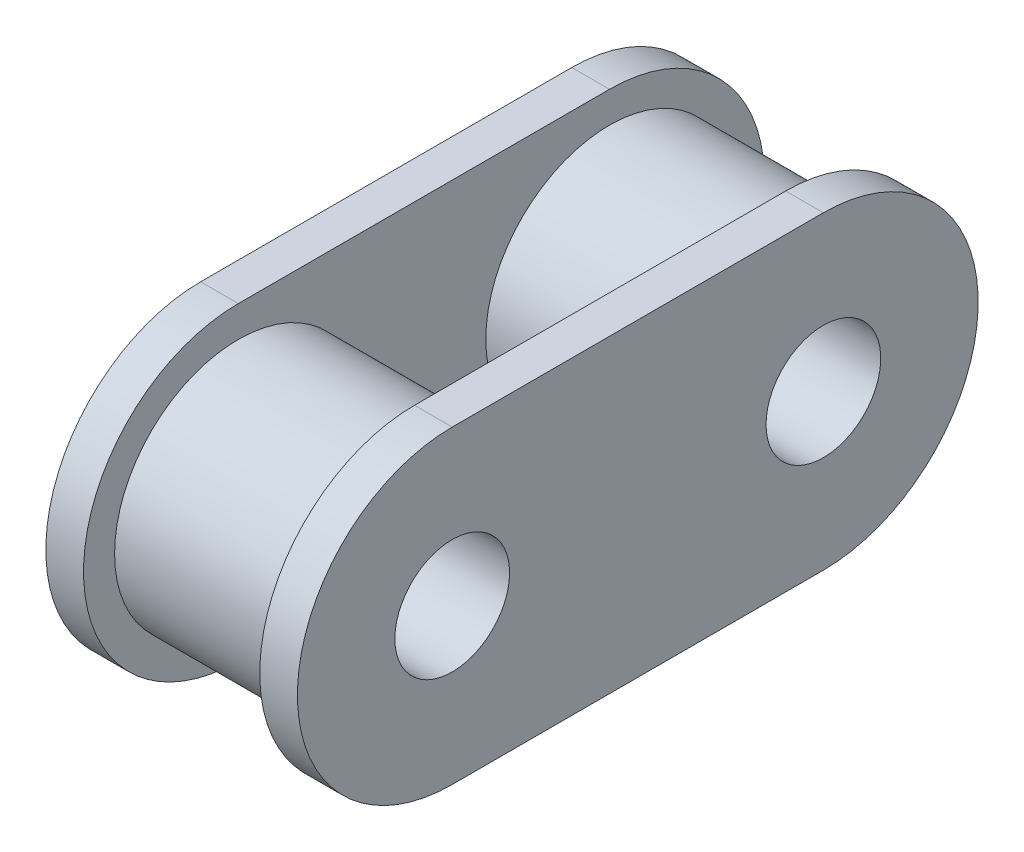
ISO-10303-21;
HEADER;
FILE_DESCRIPTION(('STEP AP214'),'2;1');
FILE_NAME('part.step','',(''),(''),'','','');
FILE_SCHEMA(('AUTOMOTIVE_DESIGN { 1 0 10303 214 1 1 1 1 }'));
ENDSEC;
DATA;
#1=APPLICATION_CONTEXT('core data for automotive mechanical design processes');
#2=APPLICATION_PROTOCOL_DEFINITION('international standard','automotive_design',2000,#1);
#3=PRODUCT_CONTEXT('',#1,'mechanical');
#4=PRODUCT('Part','Part','',(#3));
#5=PRODUCT_RELATED_PRODUCT_CATEGORY('part','',(#4));
#6=PRODUCT_DEFINITION_FORMATION('','',#4);
#7=PRODUCT_DEFINITION_CONTEXT('part definition',#1,'design');
#8=PRODUCT_DEFINITION('design','',#6,#7);
#9=PRODUCT_DEFINITION_SHAPE('','',#8);
#10=(LENGTH_UNIT() NAMED_UNIT(*) SI_UNIT(.MILLI.,.METRE.));
#11=(NAMED_UNIT(*) PLANE_ANGLE_UNIT() SI_UNIT($,.RADIAN.));
#12=(NAMED_UNIT(*) SI_UNIT($,.STERADIAN.) SOLID_ANGLE_UNIT());
#13=UNCERTAINTY_MEASURE_WITH_UNIT(LENGTH_MEASURE(1.E-05),#10,'distance_accuracy_value','');
#14=(GEOMETRIC_REPRESENTATION_CONTEXT(3) GLOBAL_UNCERTAINTY_ASSIGNED_CONTEXT((#13)) GLOBAL_UNIT_ASSIGNED_CONTEXT((#10,
#11,#12)) REPRESENTATION_CONTEXT('',''));
#15=CARTESIAN_POINT('',(0.,0.,0.));
#16=DIRECTION('',(0.,0.,1.));
#17=DIRECTION('',(1.,0.,0.));
#18=AXIS2_PLACEMENT_3D('',#15,#16,#17);
#19=CARTESIAN_POINT('',(1.424,0.,3.));
#20=DIRECTION('',(-1.,0.,0.));
#21=DIRECTION('',(0.,0.,1.));
#22=AXIS2_PLACEMENT_3D('',#19,#20,#21);
#23=CYLINDRICAL_SURFACE('',#22,2.);
#24=CARTESIAN_POINT('',(-1.424,0.,3.));
#25=DIRECTION('',(1.,0.,0.));
#26=DIRECTION('',(0.,0.,-1.));
#27=AXIS2_PLACEMENT_3D('',#24,#25,#26);
#28=CIRCLE('',#27,2.);
#29=CARTESIAN_POINT('',(-1.424,0.,5.));
#30=VERTEX_POINT('',#29);
#31=EDGE_CURVE('E181',#30,#30,#28,.T.);
#32=CARTESIAN_POINT('',(1.424,0.,3.));
#33=DIRECTION('',(1.,0.,0.));
#34=DIRECTION('',(0.,0.,-1.));
#35=AXIS2_PLACEMENT_3D('',#32,#33,#34);
#36=CIRCLE('',#35,2.);
#37=CARTESIAN_POINT('',(1.424,0.,5.));
#38=VERTEX_POINT('',#37);
#39=EDGE_CURVE('E43',#38,#38,#36,.T.);
#40=CARTESIAN_POINT('',(-1.424,0.,5.));
#41=CARTESIAN_POINT('',(-1.39433333333333,0.,5.));
#42=CARTESIAN_POINT('',(-1.36466666666667,0.,5.));
#43=CARTESIAN_POINT('',(-1.30533333333333,0.,5.));
#44=CARTESIAN_POINT('',(-1.27566666666667,0.,5.));
#45=CARTESIAN_POINT('',(-1.21633333333333,0.,5.));
#46=CARTESIAN_POINT('',(-1.18666666666667,0.,5.));
#47=CARTESIAN_POINT('',(-1.12733333333333,0.,5.));
#48=CARTESIAN_POINT('',(-1.09766666666667,0.,5.));
#49=CARTESIAN_POINT('',(-1.03833333333333,0.,5.));
#50=CARTESIAN_POINT('',(-1.00866666666667,0.,5.));
#51=CARTESIAN_POINT('',(-0.949333333333334,0.,5.));
#52=CARTESIAN_POINT('',(-0.919666666666667,0.,5.));
#53=CARTESIAN_POINT('',(-0.860333333333334,0.,5.));
#54=CARTESIAN_POINT('',(-0.830666666666667,0.,5.));
#55=CARTESIAN_POINT('',(-0.771333333333334,0.,5.));
#56=CARTESIAN_POINT('',(-0.741666666666667,0.,5.));
#57=CARTESIAN_POINT('',(-0.682333333333334,0.,5.));
#58=CARTESIAN_POINT('',(-0.652666666666667,0.,5.));
#59=CARTESIAN_POINT('',(-0.593333333333334,0.,5.));
#60=CARTESIAN_POINT('',(-0.563666666666667,0.,5.));
#61=CARTESIAN_POINT('',(-0.504333333333334,0.,5.));
#62=CARTESIAN_POINT('',(-0.474666666666667,0.,5.));
#63=CARTESIAN_POINT('',(-0.415333333333334,0.,5.));
#64=CARTESIAN_POINT('',(-0.385666666666667,0.,5.));
#65=CARTESIAN_POINT('',(-0.326333333333334,0.,5.));
#66=CARTESIAN_POINT('',(-0.296666666666667,0.,5.));
#67=CARTESIAN_POINT('',(-0.237333333333334,0.,5.));
#68=CARTESIAN_POINT('',(-0.207666666666667,0.,5.));
#69=CARTESIAN_POINT('',(-0.148333333333334,0.,5.));
#70=CARTESIAN_POINT('',(-0.118666666666667,0.,5.));
#71=CARTESIAN_POINT('',(-0.0593333333333336,0.,5.));
#72=CARTESIAN_POINT('',(-0.0296666666666669,0.,5.));
#73=CARTESIAN_POINT('',(0.0296666666666665,0.,5.));
#74=CARTESIAN_POINT('',(0.0593333333333332,0.,5.));
#75=CARTESIAN_POINT('',(0.118666666666667,0.,5.));
#76=CARTESIAN_POINT('',(0.148333333333333,0.,5.));
#77=CARTESIAN_POINT('',(0.207666666666666,0.,5.));
#78=CARTESIAN_POINT('',(0.237333333333333,0.,5.));
#79=CARTESIAN_POINT('',(0.296666666666666,0.,5.));
#80=CARTESIAN_POINT('',(0.326333333333333,0.,5.));
#81=CARTESIAN_POINT('',(0.385666666666666,0.,5.));
#82=CARTESIAN_POINT('',(0.415333333333333,0.,5.));
#83=CARTESIAN_POINT('',(0.474666666666667,0.,5.));
#84=CARTESIAN_POINT('',(0.504333333333333,0.,5.));
#85=CARTESIAN_POINT('',(0.563666666666667,0.,5.));
#86=CARTESIAN_POINT('',(0.593333333333333,0.,5.));
#87=CARTESIAN_POINT('',(0.652666666666667,0.,5.));
#88=CARTESIAN_POINT('',(0.682333333333333,0.,5.));
#89=CARTESIAN_POINT('',(0.741666666666667,0.,5.));
#90=CARTESIAN_POINT('',(0.771333333333333,0.,5.));
#91=CARTESIAN_POINT('',(0.830666666666666,0.,5.));
#92=CARTESIAN_POINT('',(0.860333333333333,0.,5.));
#93=CARTESIAN_POINT('',(0.919666666666667,0.,5.));
#94=CARTESIAN_POINT('',(0.949333333333333,0.,5.));
#95=CARTESIAN_POINT('',(1.00866666666667,0.,5.));
#96=CARTESIAN_POINT('',(1.03833333333333,0.,5.));
#97=CARTESIAN_POINT('',(1.09766666666667,0.,5.));
#98=CARTESIAN_POINT('',(1.12733333333333,0.,5.));
#99=CARTESIAN_POINT('',(1.18666666666667,0.,5.));
#100=CARTESIAN_POINT('',(1.21633333333333,0.,5.));
#101=CARTESIAN_POINT('',(1.27566666666667,0.,5.));
#102=CARTESIAN_POINT('',(1.30533333333333,0.,5.));
#103=CARTESIAN_POINT('',(1.36466666666667,0.,5.));
#104=CARTESIAN_POINT('',(1.39433333333333,0.,5.));
#105=CARTESIAN_POINT('',(1.424,0.,5.));
#106=B_SPLINE_CURVE_WITH_KNOTS('',3,(#40,#41,#42,#43,#44,#45,#46,#47,#48,#49,#50,#51,#52,#53,
#54,#55,#56,#57,#58,#59,#60,#61,#62,#63,#64,#65,#66,#67,#68,#69,#70,#71,#72,#73,#74,#75,#76,#77,
#78,#79,#80,#81,#82,#83,#84,#85,#86,#87,#88,#89,#90,#91,#92,#93,#94,#95,#96,#97,#98,#99,#100,
#101,#102,#103,#104,#105),.UNSPECIFIED.,.F.,.F.,(4,2,2,2,2,2,2,2,2,2,2,2,2,2,2,2,2,2,2,2,2,2,2,
2,2,2,2,2,2,2,2,2,4),(0.,0.0890000000000001,0.178,0.267,0.356,0.445,0.534,0.623,0.712,0.801,
0.89,0.979,1.068,1.157,1.246,1.335,1.424,1.513,1.602,1.691,1.78,1.869,1.958,2.047,2.136,2.225,
2.314,2.403,2.492,2.581,2.67,2.759,2.848),.UNSPECIFIED.);
#107=EDGE_CURVE('BSEAM34',#30,#38,#106,.T.);
#108=ORIENTED_EDGE('',*,*,#31,.T.);
#109=ORIENTED_EDGE('',*,*,#39,.F.);
#110=ORIENTED_EDGE('',*,*,#107,.T.);
#111=ORIENTED_EDGE('',*,*,#107,.F.);
#112=EDGE_LOOP('',(#108,#110,#109,#111));
#113=FACE_BOUND('',#112,.T.);
#114=ADVANCED_FACE('F34',(#113),#23,.T.);
#115=CARTESIAN_POINT('',(1.424,0.,-3.));
#116=DIRECTION('',(-1.,0.,0.));
#117=DIRECTION('',(0.,0.,1.));
#118=AXIS2_PLACEMENT_3D('',#115,#116,#117);
#119=CYLINDRICAL_SURFACE('',#118,2.);
#120=CARTESIAN_POINT('',(-1.424,0.,-3.));
#121=DIRECTION('',(1.,0.,0.));
#122=DIRECTION('',(0.,0.,-1.));
#123=AXIS2_PLACEMENT_3D('',#120,#121,#122);
#124=CIRCLE('',#123,2.);
#125=CARTESIAN_POINT('',(-1.424,0.,-1.));
#126=VERTEX_POINT('',#125);
#127=EDGE_CURVE('E37',#126,#126,#124,.T.);
#128=CARTESIAN_POINT('',(1.424,0.,-3.));
#129=DIRECTION('',(1.,0.,0.));
#130=DIRECTION('',(0.,0.,-1.));
#131=AXIS2_PLACEMENT_3D('',#128,#129,#130);
#132=CIRCLE('',#131,2.);
#133=CARTESIAN_POINT('',(1.424,0.,-1.));
#134=VERTEX_POINT('',#133);
#135=EDGE_CURVE('E11',#134,#134,#132,.T.);
#136=CARTESIAN_POINT('',(-1.424,0.,-1.));
#137=CARTESIAN_POINT('',(-1.39433333333333,0.,-1.));
#138=CARTESIAN_POINT('',(-1.36466666666667,0.,-1.));
#139=CARTESIAN_POINT('',(-1.30533333333333,0.,-1.));
#140=CARTESIAN_POINT('',(-1.27566666666667,0.,-1.));
#141=CARTESIAN_POINT('',(-1.21633333333333,0.,-1.));
#142=CARTESIAN_POINT('',(-1.18666666666667,0.,-1.));
#143=CARTESIAN_POINT('',(-1.12733333333333,0.,-1.));
#144=CARTESIAN_POINT('',(-1.09766666666667,0.,-1.));
#145=CARTESIAN_POINT('',(-1.03833333333333,0.,-1.));
#146=CARTESIAN_POINT('',(-1.00866666666667,0.,-1.));
#147=CARTESIAN_POINT('',(-0.949333333333334,0.,-1.));
#148=CARTESIAN_POINT('',(-0.919666666666667,0.,-1.));
#149=CARTESIAN_POINT('',(-0.860333333333334,0.,-1.));
#150=CARTESIAN_POINT('',(-0.830666666666667,0.,-1.));
#151=CARTESIAN_POINT('',(-0.771333333333334,0.,-1.));
#152=CARTESIAN_POINT('',(-0.741666666666667,0.,-1.));
#153=CARTESIAN_POINT('',(-0.682333333333334,0.,-1.));
#154=CARTESIAN_POINT('',(-0.652666666666667,0.,-1.));
#155=CARTESIAN_POINT('',(-0.593333333333334,0.,-1.));
#156=CARTESIAN_POINT('',(-0.563666666666667,0.,-1.));
#157=CARTESIAN_POINT('',(-0.504333333333334,0.,-1.));
#158=CARTESIAN_POINT('',(-0.474666666666667,0.,-1.));
#159=CARTESIAN_POINT('',(-0.415333333333334,0.,-1.));
#160=CARTESIAN_POINT('',(-0.385666666666667,0.,-1.));
#161=CARTESIAN_POINT('',(-0.326333333333334,0.,-1.));
#162=CARTESIAN_POINT('',(-0.296666666666667,0.,-1.));
#163=CARTESIAN_POINT('',(-0.237333333333334,0.,-1.));
#164=CARTESIAN_POINT('',(-0.207666666666667,0.,-1.));
#165=CARTESIAN_POINT('',(-0.148333333333334,0.,-1.));
#166=CARTESIAN_POINT('',(-0.118666666666667,0.,-1.));
#167=CARTESIAN_POINT('',(-0.0593333333333336,0.,-1.));
#168=CARTESIAN_POINT('',(-0.0296666666666669,0.,-1.));
#169=CARTESIAN_POINT('',(0.0296666666666665,0.,-1.));
#170=CARTESIAN_POINT('',(0.0593333333333332,0.,-1.));
#171=CARTESIAN_POINT('',(0.118666666666667,0.,-1.));
#172=CARTESIAN_POINT('',(0.148333333333333,0.,-1.));
#173=CARTESIAN_POINT('',(0.207666666666666,0.,-1.));
#174=CARTESIAN_POINT('',(0.237333333333333,0.,-1.));
#175=CARTESIAN_POINT('',(0.296666666666666,0.,-1.));
#176=CARTESIAN_POINT('',(0.326333333333333,0.,-1.));
#177=CARTESIAN_POINT('',(0.385666666666666,0.,-1.));
#178=CARTESIAN_POINT('',(0.415333333333333,0.,-1.));
#179=CARTESIAN_POINT('',(0.474666666666667,0.,-1.));
#180=CARTESIAN_POINT('',(0.504333333333333,0.,-1.));
#181=CARTESIAN_POINT('',(0.563666666666667,0.,-1.));
#182=CARTESIAN_POINT('',(0.593333333333333,0.,-1.));
#183=CARTESIAN_POINT('',(0.652666666666667,0.,-1.));
#184=CARTESIAN_POINT('',(0.682333333333333,0.,-1.));
#185=CARTESIAN_POINT('',(0.741666666666667,0.,-1.));
#186=CARTESIAN_POINT('',(0.771333333333333,0.,-1.));
#187=CARTESIAN_POINT('',(0.830666666666666,0.,-1.));
#188=CARTESIAN_POINT('',(0.860333333333333,0.,-1.));
#189=CARTESIAN_POINT('',(0.919666666666667,0.,-1.));
#190=CARTESIAN_POINT('',(0.949333333333333,0.,-1.));
#191=CARTESIAN_POINT('',(1.00866666666667,0.,-1.));
#192=CARTESIAN_POINT('',(1.03833333333333,0.,-1.));
#193=CARTESIAN_POINT('',(1.09766666666667,0.,-1.));
#194=CARTESIAN_POINT('',(1.12733333333333,0.,-1.));
#195=CARTESIAN_POINT('',(1.18666666666667,0.,-1.));
#196=CARTESIAN_POINT('',(1.21633333333333,0.,-1.));
#197=CARTESIAN_POINT('',(1.27566666666667,0.,-1.));
#198=CARTESIAN_POINT('',(1.30533333333333,0.,-1.));
#199=CARTESIAN_POINT('',(1.36466666666667,0.,-1.));
#200=CARTESIAN_POINT('',(1.39433333333333,0.,-1.));
#201=CARTESIAN_POINT('',(1.424,0.,-1.));
#202=B_SPLINE_CURVE_WITH_KNOTS('',3,(#136,#137,#138,#139,#140,#141,#142,#143,#144,#145,#146,
#147,#148,#149,#150,#151,#152,#153,#154,#155,#156,#157,#158,#159,#160,#161,#162,#163,#164,#165,
#166,#167,#168,#169,#170,#171,#172,#173,#174,#175,#176,#177,#178,#179,#180,#181,#182,#183,#184,
#185,#186,#187,#188,#189,#190,#191,#192,#193,#194,#195,#196,#197,#198,#199,#200,#201),
.UNSPECIFIED.,.F.,.F.,(4,2,2,2,2,2,2,2,2,2,2,2,2,2,2,2,2,2,2,2,2,2,2,2,2,2,2,2,2,2,2,2,4),(0.,
0.0890000000000001,0.178,0.267,0.356,0.445,0.534,0.623,0.712,0.801,0.89,0.979,1.068,1.157,1.246,
1.335,1.424,1.513,1.602,1.691,1.78,1.869,1.958,2.047,2.136,2.225,2.314,2.403,2.492,2.581,2.67,
2.759,2.848),.UNSPECIFIED.);
#203=EDGE_CURVE('BSEAM189',#126,#134,#202,.T.);
#204=ORIENTED_EDGE('',*,*,#127,.T.);
#205=ORIENTED_EDGE('',*,*,#135,.F.);
#206=ORIENTED_EDGE('',*,*,#203,.T.);
#207=ORIENTED_EDGE('',*,*,#203,.F.);
#208=EDGE_LOOP('',(#204,#206,#205,#207));
#209=FACE_BOUND('',#208,.T.);
#210=ADVANCED_FACE('F189',(#209),#119,.T.);
#211=CARTESIAN_POINT('',(1.424,0.,3.));
#212=DIRECTION('',(-1.,0.,0.));
#213=DIRECTION('',(0.,0.,1.));
#214=AXIS2_PLACEMENT_3D('',#211,#212,#213);
#215=CYLINDRICAL_SURFACE('',#214,0.927099999999999);
#216=CARTESIAN_POINT('',(2.0336,0.,3.));
#217=DIRECTION('',(1.,0.,0.));
#218=DIRECTION('',(0.,0.,-1.));
#219=AXIS2_PLACEMENT_3D('',#216,#217,#218);
#220=CIRCLE('',#219,0.927099999999999);
#221=CARTESIAN_POINT('',(2.0336,0.,3.9271));
#222=VERTEX_POINT('',#221);
#223=EDGE_CURVE('E155',#222,#222,#220,.F.);
#224=CARTESIAN_POINT('',(-2.0336,0.,3.));
#225=DIRECTION('',(1.,0.,0.));
#226=DIRECTION('',(0.,0.,-1.));
#227=AXIS2_PLACEMENT_3D('',#224,#225,#226);
#228=CIRCLE('',#227,0.927099999999999);
#229=CARTESIAN_POINT('',(-2.0336,0.,3.9271));
#230=VERTEX_POINT('',#229);
#231=EDGE_CURVE('E127',#230,#230,#228,.F.);
#232=CARTESIAN_POINT('',(2.0336,0.,3.9271));
#233=CARTESIAN_POINT('',(1.99123333333333,0.,3.9271));
#234=CARTESIAN_POINT('',(1.94886666666667,0.,3.9271));
#235=CARTESIAN_POINT('',(1.86413333333333,0.,3.9271));
#236=CARTESIAN_POINT('',(1.82176666666667,0.,3.9271));
#237=CARTESIAN_POINT('',(1.73703333333333,0.,3.9271));
#238=CARTESIAN_POINT('',(1.69466666666667,0.,3.9271));
#239=CARTESIAN_POINT('',(1.60993333333333,0.,3.9271));
#240=CARTESIAN_POINT('',(1.56756666666667,0.,3.9271));
#241=CARTESIAN_POINT('',(1.48283333333333,0.,3.9271));
#242=CARTESIAN_POINT('',(1.44046666666667,0.,3.9271));
#243=CARTESIAN_POINT('',(1.35573333333333,0.,3.9271));
#244=CARTESIAN_POINT('',(1.31336666666667,0.,3.9271));
#245=CARTESIAN_POINT('',(1.22863333333333,0.,3.9271));
#246=CARTESIAN_POINT('',(1.18626666666667,0.,3.9271));
#247=CARTESIAN_POINT('',(1.10153333333333,0.,3.9271));
#248=CARTESIAN_POINT('',(1.05916666666667,0.,3.9271));
#249=CARTESIAN_POINT('',(0.974433333333333,0.,3.9271));
#250=CARTESIAN_POINT('',(0.932066666666666,0.,3.9271));
#251=CARTESIAN_POINT('',(0.847333333333333,0.,3.9271));
#252=CARTESIAN_POINT('',(0.804966666666666,0.,3.9271));
#253=CARTESIAN_POINT('',(0.720233333333333,0.,3.9271));
#254=CARTESIAN_POINT('',(0.677866666666666,0.,3.9271));
#255=CARTESIAN_POINT('',(0.593133333333333,0.,3.9271));
#256=CARTESIAN_POINT('',(0.550766666666666,0.,3.9271));
#257=CARTESIAN_POINT('',(0.466033333333333,0.,3.9271));
#258=CARTESIAN_POINT('',(0.423666666666666,0.,3.9271));
#259=CARTESIAN_POINT('',(0.338933333333333,0.,3.9271));
#260=CARTESIAN_POINT('',(0.296566666666666,0.,3.9271));
#261=CARTESIAN_POINT('',(0.211833333333333,0.,3.9271));
#262=CARTESIAN_POINT('',(0.169466666666666,0.,3.9271));
#263=CARTESIAN_POINT('',(0.0847333333333329,0.,3.9271));
#264=CARTESIAN_POINT('',(0.0423666666666662,0.,3.9271));
#265=CARTESIAN_POINT('',(-0.0423666666666672,0.,3.9271));
#266=CARTESIAN_POINT('',(-0.0847333333333339,0.,3.9271));
#267=CARTESIAN_POINT('',(-0.169466666666667,0.,3.9271));
#268=CARTESIAN_POINT('',(-0.211833333333334,0.,3.9271));
#269=CARTESIAN_POINT('',(-0.296566666666667,0.,3.9271));
#270=CARTESIAN_POINT('',(-0.338933333333334,0.,3.9271));
#271=CARTESIAN_POINT('',(-0.423666666666667,0.,3.9271));
#272=CARTESIAN_POINT('',(-0.466033333333334,0.,3.9271));
#273=CARTESIAN_POINT('',(-0.550766666666667,0.,3.9271));
#274=CARTESIAN_POINT('',(-0.593133333333334,0.,3.9271));
#275=CARTESIAN_POINT('',(-0.677866666666667,0.,3.9271));
#276=CARTESIAN_POINT('',(-0.720233333333333,0.,3.9271));
#277=CARTESIAN_POINT('',(-0.804966666666667,0.,3.9271));
#278=CARTESIAN_POINT('',(-0.847333333333334,0.,3.9271));
#279=CARTESIAN_POINT('',(-0.932066666666667,0.,3.9271));
#280=CARTESIAN_POINT('',(-0.974433333333334,0.,3.9271));
#281=CARTESIAN_POINT('',(-1.05916666666667,0.,3.9271));
#282=CARTESIAN_POINT('',(-1.10153333333333,0.,3.9271));
#283=CARTESIAN_POINT('',(-1.18626666666667,0.,3.9271));
#284=CARTESIAN_POINT('',(-1.22863333333333,0.,3.9271));
#285=CARTESIAN_POINT('',(-1.31336666666667,0.,3.9271));
#286=CARTESIAN_POINT('',(-1.35573333333333,0.,3.9271));
#287=CARTESIAN_POINT('',(-1.44046666666667,0.,3.9271));
#288=CARTESIAN_POINT('',(-1.48283333333333,0.,3.9271));
#289=CARTESIAN_POINT('',(-1.56756666666667,0.,3.9271));
#290=CARTESIAN_POINT('',(-1.60993333333333,0.,3.9271));
#291=CARTESIAN_POINT('',(-1.69466666666667,0.,3.9271));
#292=CARTESIAN_POINT('',(-1.73703333333333,0.,3.9271));
#293=CARTESIAN_POINT('',(-1.82176666666667,0.,3.9271));
#294=CARTESIAN_POINT('',(-1.86413333333333,0.,3.9271));
#295=CARTESIAN_POINT('',(-1.94886666666667,0.,3.9271));
#296=CARTESIAN_POINT('',(-1.99123333333333,0.,3.9271));
#297=CARTESIAN_POINT('',(-2.0336,0.,3.9271));
#298=B_SPLINE_CURVE_WITH_KNOTS('',3,(#232,#233,#234,#235,#236,#237,#238,#239,#240,#241,#242,
#243,#244,#245,#246,#247,#248,#249,#250,#251,#252,#253,#254,#255,#256,#257,#258,#259,#260,#261,
#262,#263,#264,#265,#266,#267,#268,#269,#270,#271,#272,#273,#274,#275,#276,#277,#278,#279,#280,
#281,#282,#283,#284,#285,#286,#287,#288,#289,#290,#291,#292,#293,#294,#295,#296,#297),
.UNSPECIFIED.,.F.,.F.,(4,2,2,2,2,2,2,2,2,2,2,2,2,2,2,2,2,2,2,2,2,2,2,2,2,2,2,2,2,2,2,2,4),(0.,
0.1271,0.2542,0.3813,0.5084,0.6355,0.7626,0.8897,1.0168,1.1439,1.271,1.3981,1.5252,1.6523,
1.7794,1.9065,2.0336,2.1607,2.2878,2.4149,2.542,2.6691,2.7962,2.9233,3.0504,3.1775,3.3046,
3.4317,3.5588,3.6859,3.813,3.9401,4.0672),.UNSPECIFIED.);
#299=EDGE_CURVE('BSEAM216',#222,#230,#298,.T.);
#300=ORIENTED_EDGE('',*,*,#223,.F.);
#301=ORIENTED_EDGE('',*,*,#231,.T.);
#302=ORIENTED_EDGE('',*,*,#299,.T.);
#303=ORIENTED_EDGE('',*,*,#299,.F.);
#304=EDGE_LOOP('',(#300,#302,#301,#303));
#305=FACE_BOUND('',#304,.T.);
#306=ADVANCED_FACE('F216',(#305),#215,.F.);
#307=CARTESIAN_POINT('',(1.424,0.,-3.));
#308=DIRECTION('',(-1.,0.,0.));
#309=DIRECTION('',(0.,0.,1.));
#310=AXIS2_PLACEMENT_3D('',#307,#308,#309);
#311=CYLINDRICAL_SURFACE('',#310,0.927099999999999);
#312=CARTESIAN_POINT('',(2.0336,0.,-3.));
#313=DIRECTION('',(1.,0.,0.));
#314=DIRECTION('',(0.,0.,-1.));
#315=AXIS2_PLACEMENT_3D('',#312,#313,#314);
#316=CIRCLE('',#315,0.927099999999999);
#317=CARTESIAN_POINT('',(2.0336,0.,-2.0729));
#318=VERTEX_POINT('',#317);
#319=EDGE_CURVE('E152',#318,#318,#316,.F.);
#320=CARTESIAN_POINT('',(-2.0336,0.,-3.));
#321=DIRECTION('',(1.,0.,0.));
#322=DIRECTION('',(0.,0.,-1.));
#323=AXIS2_PLACEMENT_3D('',#320,#321,#322);
#324=CIRCLE('',#323,0.927099999999999);
#325=CARTESIAN_POINT('',(-2.0336,0.,-2.0729));
#326=VERTEX_POINT('',#325);
#327=EDGE_CURVE('E147',#326,#326,#324,.F.);
#328=CARTESIAN_POINT('',(2.0336,0.,-2.0729));
#329=CARTESIAN_POINT('',(1.99123333333333,0.,-2.0729));
#330=CARTESIAN_POINT('',(1.94886666666667,0.,-2.0729));
#331=CARTESIAN_POINT('',(1.86413333333333,0.,-2.0729));
#332=CARTESIAN_POINT('',(1.82176666666667,0.,-2.0729));
#333=CARTESIAN_POINT('',(1.73703333333333,0.,-2.0729));
#334=CARTESIAN_POINT('',(1.69466666666667,0.,-2.0729));
#335=CARTESIAN_POINT('',(1.60993333333333,0.,-2.0729));
#336=CARTESIAN_POINT('',(1.56756666666667,0.,-2.0729));
#337=CARTESIAN_POINT('',(1.48283333333333,0.,-2.0729));
#338=CARTESIAN_POINT('',(1.44046666666667,0.,-2.0729));
#339=CARTESIAN_POINT('',(1.35573333333333,0.,-2.0729));
#340=CARTESIAN_POINT('',(1.31336666666667,0.,-2.0729));
#341=CARTESIAN_POINT('',(1.22863333333333,0.,-2.0729));
#342=CARTESIAN_POINT('',(1.18626666666667,0.,-2.0729));
#343=CARTESIAN_POINT('',(1.10153333333333,0.,-2.0729));
#344=CARTESIAN_POINT('',(1.05916666666667,0.,-2.0729));
#345=CARTESIAN_POINT('',(0.974433333333333,0.,-2.0729));
#346=CARTESIAN_POINT('',(0.932066666666666,0.,-2.0729));
#347=CARTESIAN_POINT('',(0.847333333333333,0.,-2.0729));
#348=CARTESIAN_POINT('',(0.804966666666666,0.,-2.0729));
#349=CARTESIAN_POINT('',(0.720233333333333,0.,-2.0729));
#350=CARTESIAN_POINT('',(0.677866666666666,0.,-2.0729));
#351=CARTESIAN_POINT('',(0.593133333333333,0.,-2.0729));
#352=CARTESIAN_POINT('',(0.550766666666666,0.,-2.0729));
#353=CARTESIAN_POINT('',(0.466033333333333,0.,-2.0729));
#354=CARTESIAN_POINT('',(0.423666666666666,0.,-2.0729));
#355=CARTESIAN_POINT('',(0.338933333333333,0.,-2.0729));
#356=CARTESIAN_POINT('',(0.296566666666666,0.,-2.0729));
#357=CARTESIAN_POINT('',(0.211833333333333,0.,-2.0729));
#358=CARTESIAN_POINT('',(0.169466666666666,0.,-2.0729));
#359=CARTESIAN_POINT('',(0.0847333333333329,0.,-2.0729));
#360=CARTESIAN_POINT('',(0.0423666666666662,0.,-2.0729));
#361=CARTESIAN_POINT('',(-0.0423666666666672,0.,-2.0729));
#362=CARTESIAN_POINT('',(-0.0847333333333339,0.,-2.0729));
#363=CARTESIAN_POINT('',(-0.169466666666667,0.,-2.0729));
#364=CARTESIAN_POINT('',(-0.211833333333334,0.,-2.0729));
#365=CARTESIAN_POINT('',(-0.296566666666667,0.,-2.0729));
#366=CARTESIAN_POINT('',(-0.338933333333334,0.,-2.0729));
#367=CARTESIAN_POINT('',(-0.423666666666667,0.,-2.0729));
#368=CARTESIAN_POINT('',(-0.466033333333334,0.,-2.0729));
#369=CARTESIAN_POINT('',(-0.550766666666667,0.,-2.0729));
#370=CARTESIAN_POINT('',(-0.593133333333334,0.,-2.0729));
#371=CARTESIAN_POINT('',(-0.677866666666667,0.,-2.0729));
#372=CARTESIAN_POINT('',(-0.720233333333333,0.,-2.0729));
#373=CARTESIAN_POINT('',(-0.804966666666667,0.,-2.0729));
#374=CARTESIAN_POINT('',(-0.847333333333334,0.,-2.0729));
#375=CARTESIAN_POINT('',(-0.932066666666667,0.,-2.0729));
#376=CARTESIAN_POINT('',(-0.974433333333334,0.,-2.0729));
#377=CARTESIAN_POINT('',(-1.05916666666667,0.,-2.0729));
#378=CARTESIAN_POINT('',(-1.10153333333333,0.,-2.0729));
#379=CARTESIAN_POINT('',(-1.18626666666667,0.,-2.0729));
#380=CARTESIAN_POINT('',(-1.22863333333333,0.,-2.0729));
#381=CARTESIAN_POINT('',(-1.31336666666667,0.,-2.0729));
#382=CARTESIAN_POINT('',(-1.35573333333333,0.,-2.0729));
#383=CARTESIAN_POINT('',(-1.44046666666667,0.,-2.0729));
#384=CARTESIAN_POINT('',(-1.48283333333333,0.,-2.0729));
#385=CARTESIAN_POINT('',(-1.56756666666667,0.,-2.0729));
#386=CARTESIAN_POINT('',(-1.60993333333333,0.,-2.0729));
#387=CARTESIAN_POINT('',(-1.69466666666667,0.,-2.0729));
#388=CARTESIAN_POINT('',(-1.73703333333333,0.,-2.0729));
#389=CARTESIAN_POINT('',(-1.82176666666667,0.,-2.0729));
#390=CARTESIAN_POINT('',(-1.86413333333333,0.,-2.0729));
#391=CARTESIAN_POINT('',(-1.94886666666667,0.,-2.0729));
#392=CARTESIAN_POINT('',(-1.99123333333333,0.,-2.0729));
#393=CARTESIAN_POINT('',(-2.0336,0.,-2.0729));
#394=B_SPLINE_CURVE_WITH_KNOTS('',3,(#328,#329,#330,#331,#332,#333,#334,#335,#336,#337,#338,
#339,#340,#341,#342,#343,#344,#345,#346,#347,#348,#349,#350,#351,#352,#353,#354,#355,#356,#357,
#358,#359,#360,#361,#362,#363,#364,#365,#366,#367,#368,#369,#370,#371,#372,#373,#374,#375,#376,
#377,#378,#379,#380,#381,#382,#383,#384,#385,#386,#387,#388,#389,#390,#391,#392,#393),
.UNSPECIFIED.,.F.,.F.,(4,2,2,2,2,2,2,2,2,2,2,2,2,2,2,2,2,2,2,2,2,2,2,2,2,2,2,2,2,2,2,2,4),(0.,
0.1271,0.2542,0.3813,0.5084,0.6355,0.7626,0.8897,1.0168,1.1439,1.271,1.3981,1.5252,1.6523,
1.7794,1.9065,2.0336,2.1607,2.2878,2.4149,2.542,2.6691,2.7962,2.9233,3.0504,3.1775,3.3046,
3.4317,3.5588,3.6859,3.813,3.9401,4.0672),.UNSPECIFIED.);
#395=EDGE_CURVE('BSEAM223',#318,#326,#394,.T.);
#396=ORIENTED_EDGE('',*,*,#319,.F.);
#397=ORIENTED_EDGE('',*,*,#327,.T.);
#398=ORIENTED_EDGE('',*,*,#395,.T.);
#399=ORIENTED_EDGE('',*,*,#395,.F.);
#400=EDGE_LOOP('',(#396,#398,#397,#399));
#401=FACE_BOUND('',#400,.T.);
#402=ADVANCED_FACE('F223',(#401),#311,.F.);
#403=CARTESIAN_POINT('',(1.424,0.,0.));
#404=DIRECTION('',(1.,0.,0.));
#405=DIRECTION('',(0.,0.,-1.));
#406=AXIS2_PLACEMENT_3D('',#403,#404,#405);
#407=PLANE('',#406);
#408=ORIENTED_EDGE('',*,*,#135,.T.);
#409=EDGE_LOOP('',(#408));
#410=FACE_BOUND('',#409,.T.);
#411=DIRECTION('',(0.,0.,-1.));
#412=VECTOR('',#411,1.);
#413=CARTESIAN_POINT('',(1.424,-2.5019,0.));
#414=LINE('',#413,#412);
#415=CARTESIAN_POINT('',(1.424,-2.5019,3.));
#416=VERTEX_POINT('',#415);
#417=CARTESIAN_POINT('',(1.424,-2.5019,-3.));
#418=VERTEX_POINT('',#417);
#419=EDGE_CURVE('E118',#416,#418,#414,.T.);
#420=ORIENTED_EDGE('',*,*,#419,.F.);
#421=CARTESIAN_POINT('',(1.424,0.,3.));
#422=DIRECTION('',(1.,0.,0.));
#423=DIRECTION('',(0.,0.,-1.));
#424=AXIS2_PLACEMENT_3D('',#421,#422,#423);
#425=CIRCLE('',#424,2.5019);
#426=CARTESIAN_POINT('',(1.424,2.5019,3.));
#427=VERTEX_POINT('',#426);
#428=EDGE_CURVE('E72',#427,#416,#425,.T.);
#429=ORIENTED_EDGE('',*,*,#428,.F.);
#430=DIRECTION('',(0.,0.,-1.));
#431=VECTOR('',#430,1.);
#432=CARTESIAN_POINT('',(1.424,2.5019,0.));
#433=LINE('',#432,#431);
#434=CARTESIAN_POINT('',(1.424,2.5019,-3.));
#435=VERTEX_POINT('',#434);
#436=EDGE_CURVE('E171',#427,#435,#433,.T.);
#437=ORIENTED_EDGE('',*,*,#436,.T.);
#438=CARTESIAN_POINT('',(1.424,0.,-3.));
#439=DIRECTION('',(1.,0.,0.));
#440=DIRECTION('',(0.,0.,-1.));
#441=AXIS2_PLACEMENT_3D('',#438,#439,#440);
#442=CIRCLE('',#441,2.5019);
#443=EDGE_CURVE('E168',#418,#435,#442,.T.);
#444=ORIENTED_EDGE('',*,*,#443,.F.);
#445=EDGE_LOOP('',(#420,#429,#437,#444));
#446=FACE_BOUND('',#445,.T.);
#447=ORIENTED_EDGE('',*,*,#39,.T.);
#448=EDGE_LOOP('',(#447));
#449=FACE_BOUND('',#448,.T.);
#450=ADVANCED_FACE('F220',(#410,#446,#449),#407,.F.);
#451=CARTESIAN_POINT('',(2.0336,-2.5019,0.));
#452=DIRECTION('',(0.,1.,0.));
#453=DIRECTION('',(0.,0.,1.));
#454=AXIS2_PLACEMENT_3D('',#451,#452,#453);
#455=PLANE('',#454);
#456=ORIENTED_EDGE('',*,*,#419,.T.);
#457=DIRECTION('',(-1.,0.,0.));
#458=VECTOR('',#457,1.);
#459=CARTESIAN_POINT('',(2.0336,-2.5019,-3.));
#460=LINE('',#459,#458);
#461=CARTESIAN_POINT('',(2.0336,-2.5019,-3.));
#462=VERTEX_POINT('',#461);
#463=EDGE_CURVE('E179',#462,#418,#460,.T.);
#464=ORIENTED_EDGE('',*,*,#463,.F.);
#465=DIRECTION('',(0.,0.,-1.));
#466=VECTOR('',#465,1.);
#467=CARTESIAN_POINT('',(2.0336,-2.5019,0.));
#468=LINE('',#467,#466);
#469=CARTESIAN_POINT('',(2.0336,-2.5019,3.));
#470=VERTEX_POINT('',#469);
#471=EDGE_CURVE('E158',#470,#462,#468,.T.);
#472=ORIENTED_EDGE('',*,*,#471,.F.);
#473=DIRECTION('',(-1.,0.,0.));
#474=VECTOR('',#473,1.);
#475=CARTESIAN_POINT('',(2.0336,-2.5019,3.));
#476=LINE('',#475,#474);
#477=EDGE_CURVE('E165',#470,#416,#476,.T.);
#478=ORIENTED_EDGE('',*,*,#477,.T.);
#479=EDGE_LOOP('',(#456,#464,#472,#478));
#480=FACE_BOUND('',#479,.T.);
#481=ADVANCED_FACE('F222',(#480),#455,.F.);
#482=CARTESIAN_POINT('',(2.0336,0.,-3.));
#483=DIRECTION('',(-1.,0.,0.));
#484=DIRECTION('',(0.,0.,1.));
#485=AXIS2_PLACEMENT_3D('',#482,#483,#484);
#486=CYLINDRICAL_SURFACE('',#485,2.5019);
#487=ORIENTED_EDGE('',*,*,#443,.T.);
#488=DIRECTION('',(-1.,0.,0.));
#489=VECTOR('',#488,1.);
#490=CARTESIAN_POINT('',(2.0336,2.5019,-3.));
#491=LINE('',#490,#489);
#492=CARTESIAN_POINT('',(2.0336,2.5019,-3.));
#493=VERTEX_POINT('',#492);
#494=EDGE_CURVE('E177',#493,#435,#491,.T.);
#495=ORIENTED_EDGE('',*,*,#494,.F.);
#496=CARTESIAN_POINT('',(2.0336,0.,-3.));
#497=DIRECTION('',(1.,0.,0.));
#498=DIRECTION('',(0.,0.,-1.));
#499=AXIS2_PLACEMENT_3D('',#496,#497,#498);
#500=CIRCLE('',#499,2.5019);
#501=EDGE_CURVE('E80',#462,#493,#500,.T.);
#502=ORIENTED_EDGE('',*,*,#501,.F.);
#503=ORIENTED_EDGE('',*,*,#463,.T.);
#504=EDGE_LOOP('',(#487,#495,#502,#503));
#505=FACE_BOUND('',#504,.T.);
#506=ADVANCED_FACE('F230',(#505),#486,.T.);
#507=CARTESIAN_POINT('',(2.0336,2.5019,0.));
#508=DIRECTION('',(0.,1.,0.));
#509=DIRECTION('',(0.,0.,1.));
#510=AXIS2_PLACEMENT_3D('',#507,#508,#509);
#511=PLANE('',#510);
#512=ORIENTED_EDGE('',*,*,#436,.F.);
#513=DIRECTION('',(-1.,0.,0.));
#514=VECTOR('',#513,1.);
#515=CARTESIAN_POINT('',(2.0336,2.5019,3.));
#516=LINE('',#515,#514);
#517=CARTESIAN_POINT('',(2.0336,2.5019,3.));
#518=VERTEX_POINT('',#517);
#519=EDGE_CURVE('E69',#518,#427,#516,.T.);
#520=ORIENTED_EDGE('',*,*,#519,.F.);
#521=DIRECTION('',(0.,0.,-1.));
#522=VECTOR('',#521,1.);
#523=CARTESIAN_POINT('',(2.0336,2.5019,0.));
#524=LINE('',#523,#522);
#525=EDGE_CURVE('E161',#518,#493,#524,.T.);
#526=ORIENTED_EDGE('',*,*,#525,.T.);
#527=ORIENTED_EDGE('',*,*,#494,.T.);
#528=EDGE_LOOP('',(#512,#520,#526,#527));
#529=FACE_BOUND('',#528,.T.);
#530=ADVANCED_FACE('F243',(#529),#511,.T.);
#531=CARTESIAN_POINT('',(2.0336,0.,3.));
#532=DIRECTION('',(-1.,0.,0.));
#533=DIRECTION('',(0.,0.,1.));
#534=AXIS2_PLACEMENT_3D('',#531,#532,#533);
#535=CYLINDRICAL_SURFACE('',#534,2.5019);
#536=ORIENTED_EDGE('',*,*,#428,.T.);
#537=ORIENTED_EDGE('',*,*,#477,.F.);
#538=CARTESIAN_POINT('',(2.0336,0.,3.));
#539=DIRECTION('',(1.,0.,0.));
#540=DIRECTION('',(0.,0.,-1.));
#541=AXIS2_PLACEMENT_3D('',#538,#539,#540);
#542=CIRCLE('',#541,2.5019);
#543=EDGE_CURVE('E52',#518,#470,#542,.T.);
#544=ORIENTED_EDGE('',*,*,#543,.F.);
#545=ORIENTED_EDGE('',*,*,#519,.T.);
#546=EDGE_LOOP('',(#536,#537,#544,#545));
#547=FACE_BOUND('',#546,.T.);
#548=ADVANCED_FACE('F240',(#547),#535,.T.);
#549=CARTESIAN_POINT('',(2.0336,0.,0.));
#550=DIRECTION('',(1.,0.,0.));
#551=DIRECTION('',(0.,0.,-1.));
#552=AXIS2_PLACEMENT_3D('',#549,#550,#551);
#553=PLANE('',#552);
#554=ORIENTED_EDGE('',*,*,#319,.T.);
#555=EDGE_LOOP('',(#554));
#556=FACE_BOUND('',#555,.T.);
#557=ORIENTED_EDGE('',*,*,#223,.T.);
#558=EDGE_LOOP('',(#557));
#559=FACE_BOUND('',#558,.T.);
#560=ORIENTED_EDGE('',*,*,#471,.T.);
#561=ORIENTED_EDGE('',*,*,#501,.T.);
#562=ORIENTED_EDGE('',*,*,#525,.F.);
#563=ORIENTED_EDGE('',*,*,#543,.T.);
#564=EDGE_LOOP('',(#560,#561,#562,#563));
#565=FACE_BOUND('',#564,.T.);
#566=ADVANCED_FACE('F238',(#556,#559,#565),#553,.T.);
#567=CARTESIAN_POINT('',(-2.0336,-2.5019,0.));
#568=DIRECTION('',(0.,-1.,0.));
#569=DIRECTION('',(0.,0.,-1.));
#570=AXIS2_PLACEMENT_3D('',#567,#568,#569);
#571=PLANE('',#570);
#572=DIRECTION('',(0.,0.,-1.));
#573=VECTOR('',#572,1.);
#574=CARTESIAN_POINT('',(-1.424,-2.5019,0.));
#575=LINE('',#574,#573);
#576=CARTESIAN_POINT('',(-1.424,-2.5019,3.));
#577=VERTEX_POINT('',#576);
#578=CARTESIAN_POINT('',(-1.424,-2.5019,-3.));
#579=VERTEX_POINT('',#578);
#580=EDGE_CURVE('E113',#577,#579,#575,.T.);
#581=ORIENTED_EDGE('',*,*,#580,.F.);
#582=DIRECTION('',(1.,0.,0.));
#583=VECTOR('',#582,1.);
#584=CARTESIAN_POINT('',(-2.0336,-2.5019,3.));
#585=LINE('',#584,#583);
#586=CARTESIAN_POINT('',(-2.0336,-2.5019,3.));
#587=VERTEX_POINT('',#586);
#588=EDGE_CURVE('E107',#587,#577,#585,.T.);
#589=ORIENTED_EDGE('',*,*,#588,.F.);
#590=DIRECTION('',(0.,0.,-1.));
#591=VECTOR('',#590,1.);
#592=CARTESIAN_POINT('',(-2.0336,-2.5019,0.));
#593=LINE('',#592,#591);
#594=CARTESIAN_POINT('',(-2.0336,-2.5019,-3.));
#595=VERTEX_POINT('',#594);
#596=EDGE_CURVE('E110',#587,#595,#593,.T.);
#597=ORIENTED_EDGE('',*,*,#596,.T.);
#598=DIRECTION('',(1.,0.,0.));
#599=VECTOR('',#598,1.);
#600=CARTESIAN_POINT('',(-2.0336,-2.5019,-3.));
#601=LINE('',#600,#599);
#602=EDGE_CURVE('E137',#595,#579,#601,.T.);
#603=ORIENTED_EDGE('',*,*,#602,.T.);
#604=EDGE_LOOP('',(#581,#589,#597,#603));
#605=FACE_BOUND('',#604,.T.);
#606=ADVANCED_FACE('F109',(#605),#571,.T.);
#607=CARTESIAN_POINT('',(-2.0336,0.,3.));
#608=DIRECTION('',(1.,0.,0.));
#609=DIRECTION('',(0.,0.,-1.));
#610=AXIS2_PLACEMENT_3D('',#607,#608,#609);
#611=CYLINDRICAL_SURFACE('',#610,2.5019);
#612=CARTESIAN_POINT('',(-1.424,0.,3.));
#613=DIRECTION('',(1.,0.,0.));
#614=DIRECTION('',(0.,0.,-1.));
#615=AXIS2_PLACEMENT_3D('',#612,#613,#614);
#616=CIRCLE('',#615,2.5019);
#617=CARTESIAN_POINT('',(-1.424,2.5019,3.));
#618=VERTEX_POINT('',#617);
#619=EDGE_CURVE('E139',#618,#577,#616,.T.);
#620=ORIENTED_EDGE('',*,*,#619,.F.);
#621=DIRECTION('',(1.,0.,0.));
#622=VECTOR('',#621,1.);
#623=CARTESIAN_POINT('',(-2.0336,2.5019,3.));
#624=LINE('',#623,#622);
#625=CARTESIAN_POINT('',(-2.0336,2.5019,3.));
#626=VERTEX_POINT('',#625);
#627=EDGE_CURVE('E119',#626,#618,#624,.T.);
#628=ORIENTED_EDGE('',*,*,#627,.F.);
#629=CARTESIAN_POINT('',(-2.0336,0.,3.));
#630=DIRECTION('',(1.,0.,0.));
#631=DIRECTION('',(0.,0.,-1.));
#632=AXIS2_PLACEMENT_3D('',#629,#630,#631);
#633=CIRCLE('',#632,2.5019);
#634=EDGE_CURVE('E124',#626,#587,#633,.T.);
#635=ORIENTED_EDGE('',*,*,#634,.T.);
#636=ORIENTED_EDGE('',*,*,#588,.T.);
#637=EDGE_LOOP('',(#620,#628,#635,#636));
#638=FACE_BOUND('',#637,.T.);
#639=ADVANCED_FACE('F129',(#638),#611,.T.);
#640=CARTESIAN_POINT('',(-2.0336,2.5019,0.));
#641=DIRECTION('',(0.,-1.,0.));
#642=DIRECTION('',(0.,0.,-1.));
#643=AXIS2_PLACEMENT_3D('',#640,#641,#642);
#644=PLANE('',#643);
#645=DIRECTION('',(0.,0.,-1.));
#646=VECTOR('',#645,1.);
#647=CARTESIAN_POINT('',(-1.424,2.5019,0.));
#648=LINE('',#647,#646);
#649=CARTESIAN_POINT('',(-1.424,2.5019,-3.));
#650=VERTEX_POINT('',#649);
#651=EDGE_CURVE('E141',#618,#650,#648,.T.);
#652=ORIENTED_EDGE('',*,*,#651,.T.);
#653=DIRECTION('',(1.,0.,0.));
#654=VECTOR('',#653,1.);
#655=CARTESIAN_POINT('',(-2.0336,2.5019,-3.));
#656=LINE('',#655,#654);
#657=CARTESIAN_POINT('',(-2.0336,2.5019,-3.));
#658=VERTEX_POINT('',#657);
#659=EDGE_CURVE('E149',#658,#650,#656,.T.);
#660=ORIENTED_EDGE('',*,*,#659,.F.);
#661=DIRECTION('',(0.,0.,-1.));
#662=VECTOR('',#661,1.);
#663=CARTESIAN_POINT('',(-2.0336,2.5019,0.));
#664=LINE('',#663,#662);
#665=EDGE_CURVE('E131',#626,#658,#664,.T.);
#666=ORIENTED_EDGE('',*,*,#665,.F.);
#667=ORIENTED_EDGE('',*,*,#627,.T.);
#668=EDGE_LOOP('',(#652,#660,#666,#667));
#669=FACE_BOUND('',#668,.T.);
#670=ADVANCED_FACE('F203',(#669),#644,.F.);
#671=CARTESIAN_POINT('',(-2.0336,0.,-3.));
#672=DIRECTION('',(1.,0.,0.));
#673=DIRECTION('',(0.,0.,-1.));
#674=AXIS2_PLACEMENT_3D('',#671,#672,#673);
#675=CYLINDRICAL_SURFACE('',#674,2.5019);
#676=CARTESIAN_POINT('',(-1.424,0.,-3.));
#677=DIRECTION('',(1.,0.,0.));
#678=DIRECTION('',(0.,0.,-1.));
#679=AXIS2_PLACEMENT_3D('',#676,#677,#678);
#680=CIRCLE('',#679,2.5019);
#681=EDGE_CURVE('E144',#579,#650,#680,.T.);
#682=ORIENTED_EDGE('',*,*,#681,.F.);
#683=ORIENTED_EDGE('',*,*,#602,.F.);
#684=CARTESIAN_POINT('',(-2.0336,0.,-3.));
#685=DIRECTION('',(1.,0.,0.));
#686=DIRECTION('',(0.,0.,-1.));
#687=AXIS2_PLACEMENT_3D('',#684,#685,#686);
#688=CIRCLE('',#687,2.5019);
#689=EDGE_CURVE('E126',#595,#658,#688,.T.);
#690=ORIENTED_EDGE('',*,*,#689,.T.);
#691=ORIENTED_EDGE('',*,*,#659,.T.);
#692=EDGE_LOOP('',(#682,#683,#690,#691));
#693=FACE_BOUND('',#692,.T.);
#694=ADVANCED_FACE('F200',(#693),#675,.T.);
#695=CARTESIAN_POINT('',(-2.0336,0.,0.));
#696=DIRECTION('',(-1.,0.,0.));
#697=DIRECTION('',(0.,0.,-1.));
#698=AXIS2_PLACEMENT_3D('',#695,#696,#697);
#699=PLANE('',#698);
#700=ORIENTED_EDGE('',*,*,#327,.F.);
#701=EDGE_LOOP('',(#700));
#702=FACE_BOUND('',#701,.T.);
#703=ORIENTED_EDGE('',*,*,#231,.F.);
#704=EDGE_LOOP('',(#703));
#705=FACE_BOUND('',#704,.T.);
#706=ORIENTED_EDGE('',*,*,#596,.F.);
#707=ORIENTED_EDGE('',*,*,#634,.F.);
#708=ORIENTED_EDGE('',*,*,#665,.T.);
#709=ORIENTED_EDGE('',*,*,#689,.F.);
#710=EDGE_LOOP('',(#706,#707,#708,#709));
#711=FACE_BOUND('',#710,.T.);
#712=ADVANCED_FACE('F123',(#702,#705,#711),#699,.T.);
#713=CARTESIAN_POINT('',(-1.424,0.,0.));
#714=DIRECTION('',(-1.,0.,0.));
#715=DIRECTION('',(0.,0.,-1.));
#716=AXIS2_PLACEMENT_3D('',#713,#714,#715);
#717=PLANE('',#716);
#718=ORIENTED_EDGE('',*,*,#127,.F.);
#719=EDGE_LOOP('',(#718));
#720=FACE_BOUND('',#719,.T.);
#721=ORIENTED_EDGE('',*,*,#31,.F.);
#722=EDGE_LOOP('',(#721));
#723=FACE_BOUND('',#722,.T.);
#724=ORIENTED_EDGE('',*,*,#580,.T.);
#725=ORIENTED_EDGE('',*,*,#681,.T.);
#726=ORIENTED_EDGE('',*,*,#651,.F.);
#727=ORIENTED_EDGE('',*,*,#619,.T.);
#728=EDGE_LOOP('',(#724,#725,#726,#727));
#729=FACE_BOUND('',#728,.T.);
#730=ADVANCED_FACE('F192',(#720,#723,#729),#717,.F.);
#731=CLOSED_SHELL('',(#114,#210,#306,#402,#450,#481,#506,#530,#548,#566,#606,#639,#670,#694,
#712,#730));
#732=MANIFOLD_SOLID_BREP('B2',#731);
#733=ADVANCED_BREP_SHAPE_REPRESENTATION('',(#18,#732),#14);
#734=SHAPE_DEFINITION_REPRESENTATION(#9,#733);
ENDSEC;
END-ISO-10303-21;
